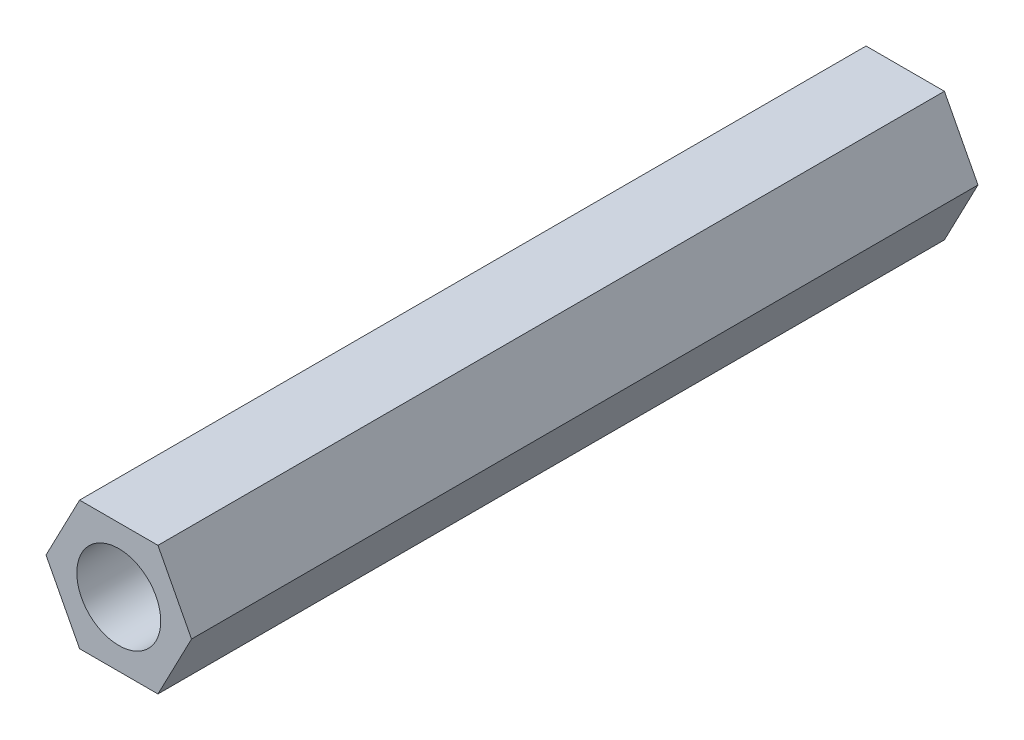
ISO-10303-21;
HEADER;
FILE_DESCRIPTION(('STEP AP214'),'2;1');
FILE_NAME('part.step','',(''),(''),'','','');
FILE_SCHEMA(('AUTOMOTIVE_DESIGN { 1 0 10303 214 1 1 1 1 }'));
ENDSEC;
DATA;
#1=APPLICATION_CONTEXT('core data for automotive mechanical design processes');
#2=APPLICATION_PROTOCOL_DEFINITION('international standard','automotive_design',2000,#1);
#3=PRODUCT_CONTEXT('',#1,'mechanical');
#4=PRODUCT('Part','Part','',(#3));
#5=PRODUCT_RELATED_PRODUCT_CATEGORY('part','',(#4));
#6=PRODUCT_DEFINITION_FORMATION('','',#4);
#7=PRODUCT_DEFINITION_CONTEXT('part definition',#1,'design');
#8=PRODUCT_DEFINITION('design','',#6,#7);
#9=PRODUCT_DEFINITION_SHAPE('','',#8);
#10=(LENGTH_UNIT() NAMED_UNIT(*) SI_UNIT(.MILLI.,.METRE.));
#11=(NAMED_UNIT(*) PLANE_ANGLE_UNIT() SI_UNIT($,.RADIAN.));
#12=(NAMED_UNIT(*) SI_UNIT($,.STERADIAN.) SOLID_ANGLE_UNIT());
#13=UNCERTAINTY_MEASURE_WITH_UNIT(LENGTH_MEASURE(1.E-05),#10,'distance_accuracy_value','');
#14=(GEOMETRIC_REPRESENTATION_CONTEXT(3) GLOBAL_UNCERTAINTY_ASSIGNED_CONTEXT((#13)) GLOBAL_UNIT_ASSIGNED_CONTEXT((#10,
#11,#12)) REPRESENTATION_CONTEXT('',''));
#15=CARTESIAN_POINT('',(0.,0.,0.));
#16=DIRECTION('',(0.,0.,1.));
#17=DIRECTION('',(1.,0.,0.));
#18=AXIS2_PLACEMENT_3D('',#15,#16,#17);
#19=CARTESIAN_POINT('',(-2.59978738302891,2.3,28.1));
#20=DIRECTION('',(0.886618456329491,-0.462501581506389,0.));
#21=DIRECTION('',(0.462501581506389,0.886618456329491,0.));
#22=AXIS2_PLACEMENT_3D('',#19,#20,#21);
#23=PLANE('',#22);
#24=DIRECTION('',(-0.462501581506389,-0.886618456329491,0.));
#25=VECTOR('',#24,1.);
#26=CARTESIAN_POINT('',(-2.59978738302891,2.3,0.));
#27=LINE('',#26,#25);
#28=CARTESIAN_POINT('',(-1.4,4.6,0.));
#29=VERTEX_POINT('',#28);
#30=CARTESIAN_POINT('',(-2.59978738302891,2.3,0.));
#31=VERTEX_POINT('',#30);
#32=EDGE_CURVE('E122',#29,#31,#27,.T.);
#33=ORIENTED_EDGE('',*,*,#32,.T.);
#34=DIRECTION('',(0.,0.,-1.));
#35=VECTOR('',#34,1.);
#36=CARTESIAN_POINT('',(-2.59978738302891,2.3,28.1));
#37=LINE('',#36,#35);
#38=CARTESIAN_POINT('',(-2.59978738302891,2.3,28.1));
#39=VERTEX_POINT('',#38);
#40=EDGE_CURVE('E11',#39,#31,#37,.T.);
#41=ORIENTED_EDGE('',*,*,#40,.F.);
#42=DIRECTION('',(-0.462501581506389,-0.886618456329491,0.));
#43=VECTOR('',#42,1.);
#44=CARTESIAN_POINT('',(-2.59978738302891,2.3,28.1));
#45=LINE('',#44,#43);
#46=CARTESIAN_POINT('',(-1.4,4.6,28.1));
#47=VERTEX_POINT('',#46);
#48=EDGE_CURVE('E133',#47,#39,#45,.T.);
#49=ORIENTED_EDGE('',*,*,#48,.F.);
#50=DIRECTION('',(0.,0.,-1.));
#51=VECTOR('',#50,1.);
#52=CARTESIAN_POINT('',(-1.4,4.6,28.1));
#53=LINE('',#52,#51);
#54=EDGE_CURVE('E118',#47,#29,#53,.T.);
#55=ORIENTED_EDGE('',*,*,#54,.T.);
#56=EDGE_LOOP('',(#33,#41,#49,#55));
#57=FACE_BOUND('',#56,.T.);
#58=ADVANCED_FACE('F38',(#57),#23,.F.);
#59=CARTESIAN_POINT('',(-1.4,0.,28.1));
#60=DIRECTION('',(0.886618456329491,0.462501581506389,0.));
#61=DIRECTION('',(-0.462501581506389,0.886618456329491,0.));
#62=AXIS2_PLACEMENT_3D('',#59,#60,#61);
#63=PLANE('',#62);
#64=DIRECTION('',(0.462501581506389,-0.886618456329491,0.));
#65=VECTOR('',#64,1.);
#66=CARTESIAN_POINT('',(-1.4,0.,0.));
#67=LINE('',#66,#65);
#68=CARTESIAN_POINT('',(-1.4,0.,0.));
#69=VERTEX_POINT('',#68);
#70=EDGE_CURVE('E125',#31,#69,#67,.T.);
#71=ORIENTED_EDGE('',*,*,#70,.T.);
#72=DIRECTION('',(0.,0.,-1.));
#73=VECTOR('',#72,1.);
#74=CARTESIAN_POINT('',(-1.4,0.,28.1));
#75=LINE('',#74,#73);
#76=CARTESIAN_POINT('',(-1.4,0.,28.1));
#77=VERTEX_POINT('',#76);
#78=EDGE_CURVE('E46',#77,#69,#75,.T.);
#79=ORIENTED_EDGE('',*,*,#78,.F.);
#80=DIRECTION('',(0.462501581506389,-0.886618456329491,0.));
#81=VECTOR('',#80,1.);
#82=CARTESIAN_POINT('',(-1.4,0.,28.1));
#83=LINE('',#82,#81);
#84=EDGE_CURVE('E91',#39,#77,#83,.T.);
#85=ORIENTED_EDGE('',*,*,#84,.F.);
#86=ORIENTED_EDGE('',*,*,#40,.T.);
#87=EDGE_LOOP('',(#71,#79,#85,#86));
#88=FACE_BOUND('',#87,.T.);
#89=ADVANCED_FACE('F158',(#88),#63,.F.);
#90=CARTESIAN_POINT('',(-1.4,0.,28.1));
#91=DIRECTION('',(0.,1.,0.));
#92=DIRECTION('',(-1.,0.,0.));
#93=AXIS2_PLACEMENT_3D('',#90,#91,#92);
#94=PLANE('',#93);
#95=DIRECTION('',(1.,0.,0.));
#96=VECTOR('',#95,1.);
#97=CARTESIAN_POINT('',(-1.4,0.,0.));
#98=LINE('',#97,#96);
#99=CARTESIAN_POINT('',(1.4,0.,0.));
#100=VERTEX_POINT('',#99);
#101=EDGE_CURVE('E128',#69,#100,#98,.T.);
#102=ORIENTED_EDGE('',*,*,#101,.T.);
#103=DIRECTION('',(0.,0.,-1.));
#104=VECTOR('',#103,1.);
#105=CARTESIAN_POINT('',(1.4,0.,28.1));
#106=LINE('',#105,#104);
#107=CARTESIAN_POINT('',(1.4,0.,28.1));
#108=VERTEX_POINT('',#107);
#109=EDGE_CURVE('E113',#108,#100,#106,.T.);
#110=ORIENTED_EDGE('',*,*,#109,.F.);
#111=DIRECTION('',(1.,0.,0.));
#112=VECTOR('',#111,1.);
#113=CARTESIAN_POINT('',(-1.4,0.,28.1));
#114=LINE('',#113,#112);
#115=EDGE_CURVE('E104',#77,#108,#114,.T.);
#116=ORIENTED_EDGE('',*,*,#115,.F.);
#117=ORIENTED_EDGE('',*,*,#78,.T.);
#118=EDGE_LOOP('',(#102,#110,#116,#117));
#119=FACE_BOUND('',#118,.T.);
#120=ADVANCED_FACE('F139',(#119),#94,.F.);
#121=CARTESIAN_POINT('',(1.4,0.,28.1));
#122=DIRECTION('',(-0.886618456329491,0.462501581506389,0.));
#123=DIRECTION('',(-0.462501581506389,-0.886618456329491,0.));
#124=AXIS2_PLACEMENT_3D('',#121,#122,#123);
#125=PLANE('',#124);
#126=DIRECTION('',(0.462501581506389,0.886618456329491,0.));
#127=VECTOR('',#126,1.);
#128=CARTESIAN_POINT('',(1.4,0.,0.));
#129=LINE('',#128,#127);
#130=CARTESIAN_POINT('',(2.59978738302891,2.3,0.));
#131=VERTEX_POINT('',#130);
#132=EDGE_CURVE('E112',#100,#131,#129,.T.);
#133=ORIENTED_EDGE('',*,*,#132,.T.);
#134=DIRECTION('',(0.,0.,-1.));
#135=VECTOR('',#134,1.);
#136=CARTESIAN_POINT('',(2.59978738302891,2.3,28.1));
#137=LINE('',#136,#135);
#138=CARTESIAN_POINT('',(2.59978738302891,2.3,28.1));
#139=VERTEX_POINT('',#138);
#140=EDGE_CURVE('E109',#139,#131,#137,.T.);
#141=ORIENTED_EDGE('',*,*,#140,.F.);
#142=DIRECTION('',(0.462501581506389,0.886618456329491,0.));
#143=VECTOR('',#142,1.);
#144=CARTESIAN_POINT('',(1.4,0.,28.1));
#145=LINE('',#144,#143);
#146=EDGE_CURVE('E98',#108,#139,#145,.T.);
#147=ORIENTED_EDGE('',*,*,#146,.F.);
#148=ORIENTED_EDGE('',*,*,#109,.T.);
#149=EDGE_LOOP('',(#133,#141,#147,#148));
#150=FACE_BOUND('',#149,.T.);
#151=ADVANCED_FACE('F110',(#150),#125,.F.);
#152=CARTESIAN_POINT('',(2.59978738302891,2.3,28.1));
#153=DIRECTION('',(-0.886618456329491,-0.462501581506389,0.));
#154=DIRECTION('',(0.462501581506389,-0.886618456329491,0.));
#155=AXIS2_PLACEMENT_3D('',#152,#153,#154);
#156=PLANE('',#155);
#157=DIRECTION('',(-0.462501581506389,0.886618456329491,0.));
#158=VECTOR('',#157,1.);
#159=CARTESIAN_POINT('',(2.59978738302891,2.3,0.));
#160=LINE('',#159,#158);
#161=CARTESIAN_POINT('',(1.4,4.6,0.));
#162=VERTEX_POINT('',#161);
#163=EDGE_CURVE('E77',#131,#162,#160,.T.);
#164=ORIENTED_EDGE('',*,*,#163,.T.);
#165=DIRECTION('',(0.,0.,-1.));
#166=VECTOR('',#165,1.);
#167=CARTESIAN_POINT('',(1.4,4.6,28.1));
#168=LINE('',#167,#166);
#169=CARTESIAN_POINT('',(1.4,4.6,28.1));
#170=VERTEX_POINT('',#169);
#171=EDGE_CURVE('E114',#170,#162,#168,.T.);
#172=ORIENTED_EDGE('',*,*,#171,.F.);
#173=DIRECTION('',(-0.462501581506389,0.886618456329491,0.));
#174=VECTOR('',#173,1.);
#175=CARTESIAN_POINT('',(2.59978738302891,2.3,28.1));
#176=LINE('',#175,#174);
#177=EDGE_CURVE('E102',#139,#170,#176,.T.);
#178=ORIENTED_EDGE('',*,*,#177,.F.);
#179=ORIENTED_EDGE('',*,*,#140,.T.);
#180=EDGE_LOOP('',(#164,#172,#178,#179));
#181=FACE_BOUND('',#180,.T.);
#182=ADVANCED_FACE('F116',(#181),#156,.F.);
#183=CARTESIAN_POINT('',(-1.4,4.6,28.1));
#184=DIRECTION('',(0.,-1.,0.));
#185=DIRECTION('',(0.,0.,-1.));
#186=AXIS2_PLACEMENT_3D('',#183,#184,#185);
#187=PLANE('',#186);
#188=DIRECTION('',(-1.,0.,0.));
#189=VECTOR('',#188,1.);
#190=CARTESIAN_POINT('',(-1.4,4.6,0.));
#191=LINE('',#190,#189);
#192=EDGE_CURVE('E83',#162,#29,#191,.T.);
#193=ORIENTED_EDGE('',*,*,#192,.T.);
#194=ORIENTED_EDGE('',*,*,#54,.F.);
#195=DIRECTION('',(-1.,0.,0.));
#196=VECTOR('',#195,1.);
#197=CARTESIAN_POINT('',(-1.4,4.6,28.1));
#198=LINE('',#197,#196);
#199=EDGE_CURVE('E54',#170,#47,#198,.T.);
#200=ORIENTED_EDGE('',*,*,#199,.F.);
#201=ORIENTED_EDGE('',*,*,#171,.T.);
#202=EDGE_LOOP('',(#193,#194,#200,#201));
#203=FACE_BOUND('',#202,.T.);
#204=ADVANCED_FACE('F146',(#203),#187,.F.);
#205=CARTESIAN_POINT('',(0.,0.,28.1));
#206=DIRECTION('',(0.,0.,-1.));
#207=DIRECTION('',(-1.,0.,0.));
#208=AXIS2_PLACEMENT_3D('',#205,#206,#207);
#209=PLANE('',#208);
#210=CARTESIAN_POINT('',(0.,2.3,28.1));
#211=DIRECTION('',(0.,0.,1.));
#212=DIRECTION('',(1.,0.,0.));
#213=AXIS2_PLACEMENT_3D('',#210,#211,#212);
#214=CIRCLE('',#213,1.5);
#215=CARTESIAN_POINT('',(1.5,2.3,28.1));
#216=VERTEX_POINT('',#215);
#217=EDGE_CURVE('E242',#216,#216,#214,.T.);
#218=ORIENTED_EDGE('',*,*,#217,.F.);
#219=EDGE_LOOP('',(#218));
#220=FACE_BOUND('',#219,.T.);
#221=ORIENTED_EDGE('',*,*,#48,.T.);
#222=ORIENTED_EDGE('',*,*,#84,.T.);
#223=ORIENTED_EDGE('',*,*,#115,.T.);
#224=ORIENTED_EDGE('',*,*,#146,.T.);
#225=ORIENTED_EDGE('',*,*,#177,.T.);
#226=ORIENTED_EDGE('',*,*,#199,.T.);
#227=EDGE_LOOP('',(#221,#222,#223,#224,#225,#226));
#228=FACE_BOUND('',#227,.T.);
#229=ADVANCED_FACE('F100',(#220,#228),#209,.F.);
#230=CARTESIAN_POINT('',(0.,0.,0.));
#231=DIRECTION('',(0.,0.,-1.));
#232=DIRECTION('',(-1.,0.,0.));
#233=AXIS2_PLACEMENT_3D('',#230,#231,#232);
#234=PLANE('',#233);
#235=CARTESIAN_POINT('',(0.,2.3,0.));
#236=DIRECTION('',(0.,0.,-1.));
#237=DIRECTION('',(-1.,0.,0.));
#238=AXIS2_PLACEMENT_3D('',#235,#236,#237);
#239=CIRCLE('',#238,1.5);
#240=CARTESIAN_POINT('',(-1.5,2.3,0.));
#241=VERTEX_POINT('',#240);
#242=EDGE_CURVE('E241',#241,#241,#239,.T.);
#243=ORIENTED_EDGE('',*,*,#242,.F.);
#244=EDGE_LOOP('',(#243));
#245=FACE_BOUND('',#244,.T.);
#246=ORIENTED_EDGE('',*,*,#32,.F.);
#247=ORIENTED_EDGE('',*,*,#192,.F.);
#248=ORIENTED_EDGE('',*,*,#163,.F.);
#249=ORIENTED_EDGE('',*,*,#132,.F.);
#250=ORIENTED_EDGE('',*,*,#101,.F.);
#251=ORIENTED_EDGE('',*,*,#70,.F.);
#252=EDGE_LOOP('',(#246,#247,#248,#249,#250,#251));
#253=FACE_BOUND('',#252,.T.);
#254=ADVANCED_FACE('F142',(#245,#253),#234,.T.);
#255=CARTESIAN_POINT('',(0.,2.3,2.));
#256=DIRECTION('',(0.,0.,-1.));
#257=DIRECTION('',(-1.,0.,0.));
#258=AXIS2_PLACEMENT_3D('',#255,#256,#257);
#259=CYLINDRICAL_SURFACE('',#258,1.5);
#260=CARTESIAN_POINT('',(0.,2.3,2.));
#261=DIRECTION('',(0.,0.,-1.));
#262=DIRECTION('',(-1.,0.,0.));
#263=AXIS2_PLACEMENT_3D('',#260,#261,#262);
#264=CIRCLE('',#263,1.5);
#265=CARTESIAN_POINT('',(-1.5,2.3,2.));
#266=VERTEX_POINT('',#265);
#267=EDGE_CURVE('E126',#266,#266,#264,.T.);
#268=ORIENTED_EDGE('',*,*,#267,.F.);
#269=EDGE_LOOP('',(#268));
#270=FACE_BOUND('',#269,.T.);
#271=ORIENTED_EDGE('',*,*,#242,.T.);
#272=EDGE_LOOP('',(#271));
#273=FACE_BOUND('',#272,.T.);
#274=ADVANCED_FACE('F190',(#270,#273),#259,.F.);
#275=CARTESIAN_POINT('',(0.,2.3,2.));
#276=DIRECTION('',(0.,0.,-1.));
#277=DIRECTION('',(-1.,0.,0.));
#278=AXIS2_PLACEMENT_3D('',#275,#276,#277);
#279=PLANE('',#278);
#280=ORIENTED_EDGE('',*,*,#267,.T.);
#281=EDGE_LOOP('',(#280));
#282=FACE_BOUND('',#281,.T.);
#283=ADVANCED_FACE('F199',(#282),#279,.T.);
#284=CARTESIAN_POINT('',(0.,2.3,25.1));
#285=DIRECTION('',(0.,0.,1.));
#286=DIRECTION('',(1.,0.,0.));
#287=AXIS2_PLACEMENT_3D('',#284,#285,#286);
#288=CYLINDRICAL_SURFACE('',#287,1.5);
#289=CARTESIAN_POINT('',(0.,2.3,25.1));
#290=DIRECTION('',(0.,0.,1.));
#291=DIRECTION('',(1.,0.,0.));
#292=AXIS2_PLACEMENT_3D('',#289,#290,#291);
#293=CIRCLE('',#292,1.5);
#294=CARTESIAN_POINT('',(1.5,2.3,25.1));
#295=VERTEX_POINT('',#294);
#296=EDGE_CURVE('E240',#295,#295,#293,.T.);
#297=ORIENTED_EDGE('',*,*,#296,.F.);
#298=EDGE_LOOP('',(#297));
#299=FACE_BOUND('',#298,.T.);
#300=ORIENTED_EDGE('',*,*,#217,.T.);
#301=EDGE_LOOP('',(#300));
#302=FACE_BOUND('',#301,.T.);
#303=ADVANCED_FACE('F209',(#299,#302),#288,.F.);
#304=CARTESIAN_POINT('',(0.,2.3,25.1));
#305=DIRECTION('',(0.,0.,1.));
#306=DIRECTION('',(1.,0.,0.));
#307=AXIS2_PLACEMENT_3D('',#304,#305,#306);
#308=PLANE('',#307);
#309=ORIENTED_EDGE('',*,*,#296,.T.);
#310=EDGE_LOOP('',(#309));
#311=FACE_BOUND('',#310,.T.);
#312=ADVANCED_FACE('F224',(#311),#308,.T.);
#313=CLOSED_SHELL('',(#58,#89,#120,#151,#182,#204,#229,#254,#274,#283,#303,#312));
#314=MANIFOLD_SOLID_BREP('B2',#313);
#315=ADVANCED_BREP_SHAPE_REPRESENTATION('',(#18,#314),#14);
#316=SHAPE_DEFINITION_REPRESENTATION(#9,#315);
ENDSEC;
END-ISO-10303-21;
